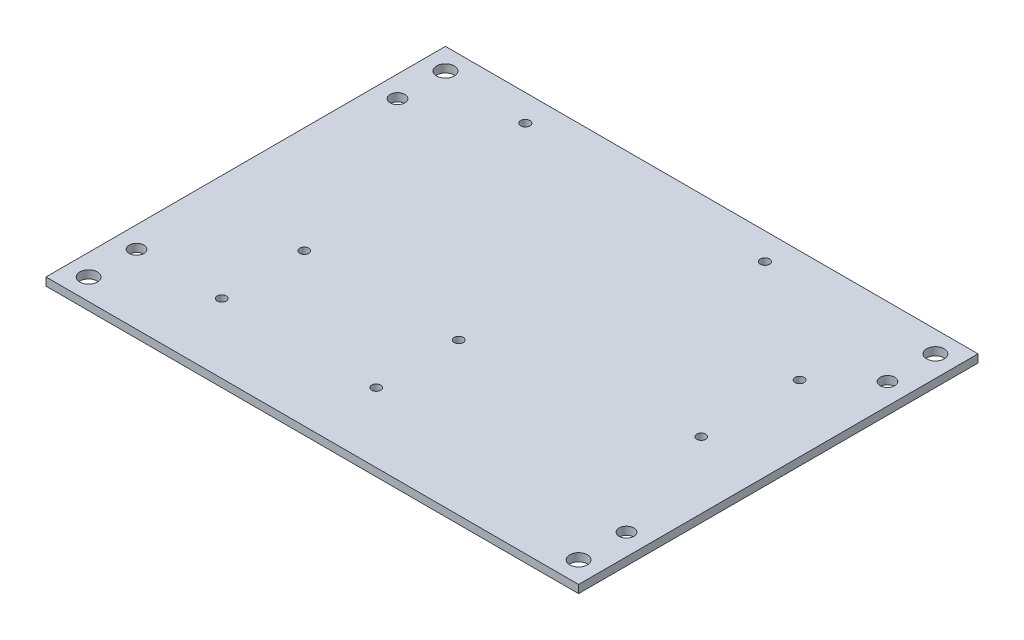
ISO-10303-21;
HEADER;
FILE_DESCRIPTION(('STEP AP214'),'2;1');
FILE_NAME('part.step','',(''),(''),'','','');
FILE_SCHEMA(('AUTOMOTIVE_DESIGN { 1 0 10303 214 1 1 1 1 }'));
ENDSEC;
DATA;
#1=APPLICATION_CONTEXT('core data for automotive mechanical design processes');
#2=APPLICATION_PROTOCOL_DEFINITION('international standard','automotive_design',2000,#1);
#3=PRODUCT_CONTEXT('',#1,'mechanical');
#4=PRODUCT('Part','Part','',(#3));
#5=PRODUCT_RELATED_PRODUCT_CATEGORY('part','',(#4));
#6=PRODUCT_DEFINITION_FORMATION('','',#4);
#7=PRODUCT_DEFINITION_CONTEXT('part definition',#1,'design');
#8=PRODUCT_DEFINITION('design','',#6,#7);
#9=PRODUCT_DEFINITION_SHAPE('','',#8);
#10=(LENGTH_UNIT() NAMED_UNIT(*) SI_UNIT(.MILLI.,.METRE.));
#11=(NAMED_UNIT(*) PLANE_ANGLE_UNIT() SI_UNIT($,.RADIAN.));
#12=(NAMED_UNIT(*) SI_UNIT($,.STERADIAN.) SOLID_ANGLE_UNIT());
#13=UNCERTAINTY_MEASURE_WITH_UNIT(LENGTH_MEASURE(1.E-05),#10,'distance_accuracy_value','');
#14=(GEOMETRIC_REPRESENTATION_CONTEXT(3) GLOBAL_UNCERTAINTY_ASSIGNED_CONTEXT((#13)) GLOBAL_UNIT_ASSIGNED_CONTEXT((#10,
#11,#12)) REPRESENTATION_CONTEXT('',''));
#15=CARTESIAN_POINT('',(0.,0.,0.));
#16=DIRECTION('',(0.,0.,1.));
#17=DIRECTION('',(1.,0.,0.));
#18=AXIS2_PLACEMENT_3D('',#15,#16,#17);
#19=CARTESIAN_POINT('',(0.,3.,0.));
#20=DIRECTION('',(1.,0.,0.));
#21=DIRECTION('',(0.,0.,-1.));
#22=AXIS2_PLACEMENT_3D('',#19,#20,#21);
#23=PLANE('',#22);
#24=DIRECTION('',(0.,0.,1.));
#25=VECTOR('',#24,1.);
#26=CARTESIAN_POINT('',(0.,0.,0.));
#27=LINE('',#26,#25);
#28=CARTESIAN_POINT('',(0.,0.,-150.));
#29=VERTEX_POINT('',#28);
#30=CARTESIAN_POINT('',(0.,0.,0.));
#31=VERTEX_POINT('',#30);
#32=EDGE_CURVE('E106',#29,#31,#27,.T.);
#33=ORIENTED_EDGE('',*,*,#32,.T.);
#34=DIRECTION('',(0.,-1.,0.));
#35=VECTOR('',#34,1.);
#36=CARTESIAN_POINT('',(0.,3.,0.));
#37=LINE('',#36,#35);
#38=CARTESIAN_POINT('',(0.,3.,0.));
#39=VERTEX_POINT('',#38);
#40=EDGE_CURVE('E11',#39,#31,#37,.T.);
#41=ORIENTED_EDGE('',*,*,#40,.F.);
#42=DIRECTION('',(0.,0.,1.));
#43=VECTOR('',#42,1.);
#44=CARTESIAN_POINT('',(0.,3.,0.));
#45=LINE('',#44,#43);
#46=CARTESIAN_POINT('',(0.,3.,-150.));
#47=VERTEX_POINT('',#46);
#48=EDGE_CURVE('E94',#47,#39,#45,.T.);
#49=ORIENTED_EDGE('',*,*,#48,.F.);
#50=DIRECTION('',(0.,-1.,0.));
#51=VECTOR('',#50,1.);
#52=CARTESIAN_POINT('',(0.,3.,-150.));
#53=LINE('',#52,#51);
#54=EDGE_CURVE('E102',#47,#29,#53,.T.);
#55=ORIENTED_EDGE('',*,*,#54,.T.);
#56=EDGE_LOOP('',(#33,#41,#49,#55));
#57=FACE_BOUND('',#56,.T.);
#58=ADVANCED_FACE('F43',(#57),#23,.F.);
#59=CARTESIAN_POINT('',(0.,3.,0.));
#60=DIRECTION('',(0.,0.,-1.));
#61=DIRECTION('',(-1.,0.,0.));
#62=AXIS2_PLACEMENT_3D('',#59,#60,#61);
#63=PLANE('',#62);
#64=DIRECTION('',(1.,0.,0.));
#65=VECTOR('',#64,1.);
#66=CARTESIAN_POINT('',(0.,0.,0.));
#67=LINE('',#66,#65);
#68=CARTESIAN_POINT('',(200.,0.,0.));
#69=VERTEX_POINT('',#68);
#70=EDGE_CURVE('E98',#31,#69,#67,.T.);
#71=ORIENTED_EDGE('',*,*,#70,.T.);
#72=DIRECTION('',(0.,-1.,0.));
#73=VECTOR('',#72,1.);
#74=CARTESIAN_POINT('',(200.,3.,0.));
#75=LINE('',#74,#73);
#76=CARTESIAN_POINT('',(200.,3.,0.));
#77=VERTEX_POINT('',#76);
#78=EDGE_CURVE('E51',#77,#69,#75,.T.);
#79=ORIENTED_EDGE('',*,*,#78,.F.);
#80=DIRECTION('',(1.,0.,0.));
#81=VECTOR('',#80,1.);
#82=CARTESIAN_POINT('',(0.,3.,0.));
#83=LINE('',#82,#81);
#84=EDGE_CURVE('E89',#39,#77,#83,.T.);
#85=ORIENTED_EDGE('',*,*,#84,.F.);
#86=ORIENTED_EDGE('',*,*,#40,.T.);
#87=EDGE_LOOP('',(#71,#79,#85,#86));
#88=FACE_BOUND('',#87,.T.);
#89=ADVANCED_FACE('F97',(#88),#63,.F.);
#90=CARTESIAN_POINT('',(200.,3.,0.));
#91=DIRECTION('',(-1.,0.,0.));
#92=DIRECTION('',(0.,0.,1.));
#93=AXIS2_PLACEMENT_3D('',#90,#91,#92);
#94=PLANE('',#93);
#95=DIRECTION('',(0.,0.,-1.));
#96=VECTOR('',#95,1.);
#97=CARTESIAN_POINT('',(200.,0.,0.));
#98=LINE('',#97,#96);
#99=CARTESIAN_POINT('',(200.,0.,-150.));
#100=VERTEX_POINT('',#99);
#101=EDGE_CURVE('E76',#69,#100,#98,.T.);
#102=ORIENTED_EDGE('',*,*,#101,.T.);
#103=DIRECTION('',(0.,-1.,0.));
#104=VECTOR('',#103,1.);
#105=CARTESIAN_POINT('',(200.,3.,-150.));
#106=LINE('',#105,#104);
#107=CARTESIAN_POINT('',(200.,3.,-150.));
#108=VERTEX_POINT('',#107);
#109=EDGE_CURVE('E99',#108,#100,#106,.T.);
#110=ORIENTED_EDGE('',*,*,#109,.F.);
#111=DIRECTION('',(0.,0.,-1.));
#112=VECTOR('',#111,1.);
#113=CARTESIAN_POINT('',(200.,3.,0.));
#114=LINE('',#113,#112);
#115=EDGE_CURVE('E92',#77,#108,#114,.T.);
#116=ORIENTED_EDGE('',*,*,#115,.F.);
#117=ORIENTED_EDGE('',*,*,#78,.T.);
#118=EDGE_LOOP('',(#102,#110,#116,#117));
#119=FACE_BOUND('',#118,.T.);
#120=ADVANCED_FACE('F100',(#119),#94,.F.);
#121=CARTESIAN_POINT('',(0.,3.,-150.));
#122=DIRECTION('',(0.,0.,1.));
#123=DIRECTION('',(1.,0.,0.));
#124=AXIS2_PLACEMENT_3D('',#121,#122,#123);
#125=PLANE('',#124);
#126=DIRECTION('',(-1.,0.,0.));
#127=VECTOR('',#126,1.);
#128=CARTESIAN_POINT('',(0.,0.,-150.));
#129=LINE('',#128,#127);
#130=EDGE_CURVE('E82',#100,#29,#129,.T.);
#131=ORIENTED_EDGE('',*,*,#130,.T.);
#132=ORIENTED_EDGE('',*,*,#54,.F.);
#133=DIRECTION('',(-1.,0.,0.));
#134=VECTOR('',#133,1.);
#135=CARTESIAN_POINT('',(0.,3.,-150.));
#136=LINE('',#135,#134);
#137=EDGE_CURVE('E59',#108,#47,#136,.T.);
#138=ORIENTED_EDGE('',*,*,#137,.F.);
#139=ORIENTED_EDGE('',*,*,#109,.T.);
#140=EDGE_LOOP('',(#131,#132,#138,#139));
#141=FACE_BOUND('',#140,.T.);
#142=ADVANCED_FACE('F114',(#141),#125,.F.);
#143=CARTESIAN_POINT('',(0.,3.,0.));
#144=DIRECTION('',(0.,-1.,0.));
#145=DIRECTION('',(0.,0.,-1.));
#146=AXIS2_PLACEMENT_3D('',#143,#144,#145);
#147=PLANE('',#146);
#148=CARTESIAN_POINT('',(98.,3.,-57.));
#149=DIRECTION('',(0.,1.,0.));
#150=DIRECTION('',(0.,0.,1.));
#151=AXIS2_PLACEMENT_3D('',#148,#149,#150);
#152=CIRCLE('',#151,1.70000000000001);
#153=CARTESIAN_POINT('',(98.,3.,-55.3));
#154=VERTEX_POINT('',#153);
#155=EDGE_CURVE('E133',#154,#154,#152,.T.);
#156=ORIENTED_EDGE('',*,*,#155,.F.);
#157=EDGE_LOOP('',(#156));
#158=FACE_BOUND('',#157,.T.);
#159=CARTESIAN_POINT('',(98.,3.,-26.));
#160=DIRECTION('',(0.,1.,0.));
#161=DIRECTION('',(0.,0.,1.));
#162=AXIS2_PLACEMENT_3D('',#159,#160,#161);
#163=CIRCLE('',#162,1.70000000000001);
#164=CARTESIAN_POINT('',(98.,3.,-24.3));
#165=VERTEX_POINT('',#164);
#166=EDGE_CURVE('E150',#165,#165,#163,.T.);
#167=ORIENTED_EDGE('',*,*,#166,.F.);
#168=EDGE_LOOP('',(#167));
#169=FACE_BOUND('',#168,.T.);
#170=CARTESIAN_POINT('',(40.,3.,-26.));
#171=DIRECTION('',(0.,1.,0.));
#172=DIRECTION('',(0.,0.,1.));
#173=AXIS2_PLACEMENT_3D('',#170,#171,#172);
#174=CIRCLE('',#173,1.7);
#175=CARTESIAN_POINT('',(40.,3.,-24.3));
#176=VERTEX_POINT('',#175);
#177=EDGE_CURVE('E157',#176,#176,#174,.T.);
#178=ORIENTED_EDGE('',*,*,#177,.F.);
#179=EDGE_LOOP('',(#178));
#180=FACE_BOUND('',#179,.T.);
#181=CARTESIAN_POINT('',(175.,3.,-108.));
#182=DIRECTION('',(0.,1.,0.));
#183=DIRECTION('',(0.,0.,1.));
#184=AXIS2_PLACEMENT_3D('',#181,#182,#183);
#185=CIRCLE('',#184,1.70000000000001);
#186=CARTESIAN_POINT('',(175.,3.,-106.3));
#187=VERTEX_POINT('',#186);
#188=EDGE_CURVE('E162',#187,#187,#185,.T.);
#189=ORIENTED_EDGE('',*,*,#188,.F.);
#190=EDGE_LOOP('',(#189));
#191=FACE_BOUND('',#190,.T.);
#192=CARTESIAN_POINT('',(40.,3.,-57.));
#193=DIRECTION('',(0.,1.,0.));
#194=DIRECTION('',(0.,0.,1.));
#195=AXIS2_PLACEMENT_3D('',#192,#193,#194);
#196=CIRCLE('',#195,1.7);
#197=CARTESIAN_POINT('',(40.,3.,-55.3));
#198=VERTEX_POINT('',#197);
#199=EDGE_CURVE('E126',#198,#198,#196,.T.);
#200=ORIENTED_EDGE('',*,*,#199,.F.);
#201=EDGE_LOOP('',(#200));
#202=FACE_BOUND('',#201,.T.);
#203=CARTESIAN_POINT('',(192.,3.,-142.));
#204=DIRECTION('',(0.,1.,0.));
#205=DIRECTION('',(0.,0.,-1.));
#206=AXIS2_PLACEMENT_3D('',#203,#204,#205);
#207=CIRCLE('',#206,3.3);
#208=CARTESIAN_POINT('',(192.,3.,-145.3));
#209=VERTEX_POINT('',#208);
#210=EDGE_CURVE('E134',#209,#209,#207,.T.);
#211=ORIENTED_EDGE('',*,*,#210,.F.);
#212=EDGE_LOOP('',(#211));
#213=FACE_BOUND('',#212,.T.);
#214=CARTESIAN_POINT('',(192.,3.,-8.00000000000004));
#215=DIRECTION('',(0.,1.,0.));
#216=DIRECTION('',(0.,0.,1.));
#217=AXIS2_PLACEMENT_3D('',#214,#215,#216);
#218=CIRCLE('',#217,3.3);
#219=CARTESIAN_POINT('',(192.,3.,-4.70000000000003));
#220=VERTEX_POINT('',#219);
#221=EDGE_CURVE('E140',#220,#220,#218,.T.);
#222=ORIENTED_EDGE('',*,*,#221,.F.);
#223=EDGE_LOOP('',(#222));
#224=FACE_BOUND('',#223,.T.);
#225=CARTESIAN_POINT('',(8.00000000000001,3.,-8.00000000000004));
#226=DIRECTION('',(0.,1.,0.));
#227=DIRECTION('',(0.,0.,-1.));
#228=AXIS2_PLACEMENT_3D('',#225,#226,#227);
#229=CIRCLE('',#228,3.3);
#230=CARTESIAN_POINT('',(8.00000000000001,3.,-11.3));
#231=VERTEX_POINT('',#230);
#232=EDGE_CURVE('E125',#231,#231,#229,.T.);
#233=ORIENTED_EDGE('',*,*,#232,.F.);
#234=EDGE_LOOP('',(#233));
#235=FACE_BOUND('',#234,.T.);
#236=CARTESIAN_POINT('',(192.,3.,-124.));
#237=DIRECTION('',(0.,1.,0.));
#238=DIRECTION('',(0.,0.,-1.));
#239=AXIS2_PLACEMENT_3D('',#236,#237,#238);
#240=CIRCLE('',#239,2.74999999999998);
#241=CARTESIAN_POINT('',(192.,3.,-126.75));
#242=VERTEX_POINT('',#241);
#243=EDGE_CURVE('E193',#242,#242,#240,.T.);
#244=ORIENTED_EDGE('',*,*,#243,.F.);
#245=EDGE_LOOP('',(#244));
#246=FACE_BOUND('',#245,.T.);
#247=CARTESIAN_POINT('',(40.,3.,-140.));
#248=DIRECTION('',(0.,1.,0.));
#249=DIRECTION('',(0.,0.,1.));
#250=AXIS2_PLACEMENT_3D('',#247,#248,#249);
#251=CIRCLE('',#250,1.75);
#252=CARTESIAN_POINT('',(40.,3.,-138.25));
#253=VERTEX_POINT('',#252);
#254=EDGE_CURVE('E198',#253,#253,#251,.T.);
#255=ORIENTED_EDGE('',*,*,#254,.F.);
#256=EDGE_LOOP('',(#255));
#257=FACE_BOUND('',#256,.T.);
#258=CARTESIAN_POINT('',(130.,3.,-140.));
#259=DIRECTION('',(0.,1.,0.));
#260=DIRECTION('',(0.,0.,1.));
#261=AXIS2_PLACEMENT_3D('',#258,#259,#260);
#262=CIRCLE('',#261,1.75000000000001);
#263=CARTESIAN_POINT('',(130.,3.,-138.25));
#264=VERTEX_POINT('',#263);
#265=EDGE_CURVE('E205',#264,#264,#262,.T.);
#266=ORIENTED_EDGE('',*,*,#265,.F.);
#267=EDGE_LOOP('',(#266));
#268=FACE_BOUND('',#267,.T.);
#269=CARTESIAN_POINT('',(175.,3.,-71.07));
#270=DIRECTION('',(0.,1.,0.));
#271=DIRECTION('',(0.,0.,1.));
#272=AXIS2_PLACEMENT_3D('',#269,#270,#271);
#273=CIRCLE('',#272,1.70000000000001);
#274=CARTESIAN_POINT('',(175.,3.,-69.37));
#275=VERTEX_POINT('',#274);
#276=EDGE_CURVE('E169',#275,#275,#273,.T.);
#277=ORIENTED_EDGE('',*,*,#276,.F.);
#278=EDGE_LOOP('',(#277));
#279=FACE_BOUND('',#278,.T.);
#280=CARTESIAN_POINT('',(8.00000000000001,3.,-26.));
#281=DIRECTION('',(0.,1.,0.));
#282=DIRECTION('',(0.,0.,-1.));
#283=AXIS2_PLACEMENT_3D('',#280,#281,#282);
#284=CIRCLE('',#283,2.75);
#285=CARTESIAN_POINT('',(8.00000000000001,3.,-28.75));
#286=VERTEX_POINT('',#285);
#287=EDGE_CURVE('E174',#286,#286,#284,.T.);
#288=ORIENTED_EDGE('',*,*,#287,.F.);
#289=EDGE_LOOP('',(#288));
#290=FACE_BOUND('',#289,.T.);
#291=CARTESIAN_POINT('',(8.00000000000001,3.,-124.));
#292=DIRECTION('',(0.,1.,0.));
#293=DIRECTION('',(0.,0.,1.));
#294=AXIS2_PLACEMENT_3D('',#291,#292,#293);
#295=CIRCLE('',#294,2.75);
#296=CARTESIAN_POINT('',(8.00000000000001,3.,-121.25));
#297=VERTEX_POINT('',#296);
#298=EDGE_CURVE('E181',#297,#297,#295,.T.);
#299=ORIENTED_EDGE('',*,*,#298,.F.);
#300=EDGE_LOOP('',(#299));
#301=FACE_BOUND('',#300,.T.);
#302=CARTESIAN_POINT('',(192.,3.,-26.0000000000001));
#303=DIRECTION('',(0.,1.,0.));
#304=DIRECTION('',(0.,0.,1.));
#305=AXIS2_PLACEMENT_3D('',#302,#303,#304);
#306=CIRCLE('',#305,2.74999999999998);
#307=CARTESIAN_POINT('',(192.,3.,-23.2500000000001));
#308=VERTEX_POINT('',#307);
#309=EDGE_CURVE('E186',#308,#308,#306,.T.);
#310=ORIENTED_EDGE('',*,*,#309,.F.);
#311=EDGE_LOOP('',(#310));
#312=FACE_BOUND('',#311,.T.);
#313=CARTESIAN_POINT('',(8.00000000000001,3.,-142.));
#314=DIRECTION('',(0.,1.,0.));
#315=DIRECTION('',(0.,0.,1.));
#316=AXIS2_PLACEMENT_3D('',#313,#314,#315);
#317=CIRCLE('',#316,3.3);
#318=CARTESIAN_POINT('',(8.00000000000001,3.,-138.7));
#319=VERTEX_POINT('',#318);
#320=EDGE_CURVE('E122',#319,#319,#317,.T.);
#321=ORIENTED_EDGE('',*,*,#320,.F.);
#322=EDGE_LOOP('',(#321));
#323=FACE_BOUND('',#322,.T.);
#324=ORIENTED_EDGE('',*,*,#48,.T.);
#325=ORIENTED_EDGE('',*,*,#84,.T.);
#326=ORIENTED_EDGE('',*,*,#115,.T.);
#327=ORIENTED_EDGE('',*,*,#137,.T.);
#328=EDGE_LOOP('',(#324,#325,#326,#327));
#329=FACE_BOUND('',#328,.T.);
#330=ADVANCED_FACE('F90',(#158,#169,#180,#191,#202,#213,#224,#235,#246,#257,#268,#279,#290,#301,
#312,#323,#329),#147,.F.);
#331=CARTESIAN_POINT('',(0.,0.,0.));
#332=DIRECTION('',(0.,-1.,0.));
#333=DIRECTION('',(0.,0.,-1.));
#334=AXIS2_PLACEMENT_3D('',#331,#332,#333);
#335=PLANE('',#334);
#336=CARTESIAN_POINT('',(98.,0.,-57.));
#337=DIRECTION('',(0.,-1.,0.));
#338=DIRECTION('',(0.,0.,-1.));
#339=AXIS2_PLACEMENT_3D('',#336,#337,#338);
#340=CIRCLE('',#339,1.70000000000001);
#341=CARTESIAN_POINT('',(98.,0.,-58.7));
#342=VERTEX_POINT('',#341);
#343=EDGE_CURVE('E153',#342,#342,#340,.F.);
#344=ORIENTED_EDGE('',*,*,#343,.T.);
#345=EDGE_LOOP('',(#344));
#346=FACE_BOUND('',#345,.T.);
#347=CARTESIAN_POINT('',(98.,0.,-26.));
#348=DIRECTION('',(0.,-1.,0.));
#349=DIRECTION('',(0.,0.,-1.));
#350=AXIS2_PLACEMENT_3D('',#347,#348,#349);
#351=CIRCLE('',#350,1.70000000000001);
#352=CARTESIAN_POINT('',(98.,0.,-27.7));
#353=VERTEX_POINT('',#352);
#354=EDGE_CURVE('E154',#353,#353,#351,.F.);
#355=ORIENTED_EDGE('',*,*,#354,.T.);
#356=EDGE_LOOP('',(#355));
#357=FACE_BOUND('',#356,.T.);
#358=CARTESIAN_POINT('',(40.,0.,-26.));
#359=DIRECTION('',(0.,-1.,0.));
#360=DIRECTION('',(0.,0.,-1.));
#361=AXIS2_PLACEMENT_3D('',#358,#359,#360);
#362=CIRCLE('',#361,1.7);
#363=CARTESIAN_POINT('',(40.,0.,-27.7));
#364=VERTEX_POINT('',#363);
#365=EDGE_CURVE('E165',#364,#364,#362,.F.);
#366=ORIENTED_EDGE('',*,*,#365,.T.);
#367=EDGE_LOOP('',(#366));
#368=FACE_BOUND('',#367,.T.);
#369=CARTESIAN_POINT('',(175.,0.,-108.));
#370=DIRECTION('',(0.,-1.,0.));
#371=DIRECTION('',(0.,0.,-1.));
#372=AXIS2_PLACEMENT_3D('',#369,#370,#371);
#373=CIRCLE('',#372,1.70000000000001);
#374=CARTESIAN_POINT('',(175.,0.,-109.7));
#375=VERTEX_POINT('',#374);
#376=EDGE_CURVE('E166',#375,#375,#373,.F.);
#377=ORIENTED_EDGE('',*,*,#376,.T.);
#378=EDGE_LOOP('',(#377));
#379=FACE_BOUND('',#378,.T.);
#380=CARTESIAN_POINT('',(40.,0.,-57.));
#381=DIRECTION('',(0.,-1.,0.));
#382=DIRECTION('',(0.,0.,-1.));
#383=AXIS2_PLACEMENT_3D('',#380,#381,#382);
#384=CIRCLE('',#383,1.7);
#385=CARTESIAN_POINT('',(40.,0.,-58.7));
#386=VERTEX_POINT('',#385);
#387=EDGE_CURVE('E130',#386,#386,#384,.F.);
#388=ORIENTED_EDGE('',*,*,#387,.T.);
#389=EDGE_LOOP('',(#388));
#390=FACE_BOUND('',#389,.T.);
#391=CARTESIAN_POINT('',(192.,0.,-142.));
#392=DIRECTION('',(0.,-1.,0.));
#393=DIRECTION('',(0.,0.,-1.));
#394=AXIS2_PLACEMENT_3D('',#391,#392,#393);
#395=CIRCLE('',#394,3.3);
#396=CARTESIAN_POINT('',(192.,0.,-145.3));
#397=VERTEX_POINT('',#396);
#398=EDGE_CURVE('E129',#397,#397,#395,.F.);
#399=ORIENTED_EDGE('',*,*,#398,.T.);
#400=EDGE_LOOP('',(#399));
#401=FACE_BOUND('',#400,.T.);
#402=CARTESIAN_POINT('',(192.,0.,-8.00000000000004));
#403=DIRECTION('',(0.,-1.,0.));
#404=DIRECTION('',(0.,0.,-1.));
#405=AXIS2_PLACEMENT_3D('',#402,#403,#404);
#406=CIRCLE('',#405,3.3);
#407=CARTESIAN_POINT('',(192.,0.,-11.3));
#408=VERTEX_POINT('',#407);
#409=EDGE_CURVE('E137',#408,#408,#406,.F.);
#410=ORIENTED_EDGE('',*,*,#409,.T.);
#411=EDGE_LOOP('',(#410));
#412=FACE_BOUND('',#411,.T.);
#413=CARTESIAN_POINT('',(8.00000000000001,0.,-8.00000000000004));
#414=DIRECTION('',(0.,-1.,0.));
#415=DIRECTION('',(0.,0.,-1.));
#416=AXIS2_PLACEMENT_3D('',#413,#414,#415);
#417=CIRCLE('',#416,3.3);
#418=CARTESIAN_POINT('',(8.00000000000001,0.,-11.3));
#419=VERTEX_POINT('',#418);
#420=EDGE_CURVE('E143',#419,#419,#417,.F.);
#421=ORIENTED_EDGE('',*,*,#420,.T.);
#422=EDGE_LOOP('',(#421));
#423=FACE_BOUND('',#422,.T.);
#424=CARTESIAN_POINT('',(192.,0.,-124.));
#425=DIRECTION('',(0.,-1.,0.));
#426=DIRECTION('',(0.,0.,-1.));
#427=AXIS2_PLACEMENT_3D('',#424,#425,#426);
#428=CIRCLE('',#427,2.74999999999998);
#429=CARTESIAN_POINT('',(192.,0.,-126.75));
#430=VERTEX_POINT('',#429);
#431=EDGE_CURVE('E201',#430,#430,#428,.F.);
#432=ORIENTED_EDGE('',*,*,#431,.T.);
#433=EDGE_LOOP('',(#432));
#434=FACE_BOUND('',#433,.T.);
#435=CARTESIAN_POINT('',(40.,0.,-140.));
#436=DIRECTION('',(0.,-1.,0.));
#437=DIRECTION('',(0.,0.,-1.));
#438=AXIS2_PLACEMENT_3D('',#435,#436,#437);
#439=CIRCLE('',#438,1.75);
#440=CARTESIAN_POINT('',(40.,0.,-141.75));
#441=VERTEX_POINT('',#440);
#442=EDGE_CURVE('E202',#441,#441,#439,.F.);
#443=ORIENTED_EDGE('',*,*,#442,.T.);
#444=EDGE_LOOP('',(#443));
#445=FACE_BOUND('',#444,.T.);
#446=CARTESIAN_POINT('',(130.,0.,-140.));
#447=DIRECTION('',(0.,-1.,0.));
#448=DIRECTION('',(0.,0.,-1.));
#449=AXIS2_PLACEMENT_3D('',#446,#447,#448);
#450=CIRCLE('',#449,1.75000000000001);
#451=CARTESIAN_POINT('',(130.,0.,-141.75));
#452=VERTEX_POINT('',#451);
#453=EDGE_CURVE('E212',#452,#452,#450,.F.);
#454=ORIENTED_EDGE('',*,*,#453,.T.);
#455=EDGE_LOOP('',(#454));
#456=FACE_BOUND('',#455,.T.);
#457=CARTESIAN_POINT('',(175.,0.,-71.07));
#458=DIRECTION('',(0.,-1.,0.));
#459=DIRECTION('',(0.,0.,-1.));
#460=AXIS2_PLACEMENT_3D('',#457,#458,#459);
#461=CIRCLE('',#460,1.70000000000001);
#462=CARTESIAN_POINT('',(175.,0.,-72.77));
#463=VERTEX_POINT('',#462);
#464=EDGE_CURVE('E177',#463,#463,#461,.F.);
#465=ORIENTED_EDGE('',*,*,#464,.T.);
#466=EDGE_LOOP('',(#465));
#467=FACE_BOUND('',#466,.T.);
#468=CARTESIAN_POINT('',(8.00000000000001,0.,-26.));
#469=DIRECTION('',(0.,-1.,0.));
#470=DIRECTION('',(0.,0.,-1.));
#471=AXIS2_PLACEMENT_3D('',#468,#469,#470);
#472=CIRCLE('',#471,2.75);
#473=CARTESIAN_POINT('',(8.00000000000001,0.,-28.75));
#474=VERTEX_POINT('',#473);
#475=EDGE_CURVE('E178',#474,#474,#472,.F.);
#476=ORIENTED_EDGE('',*,*,#475,.T.);
#477=EDGE_LOOP('',(#476));
#478=FACE_BOUND('',#477,.T.);
#479=CARTESIAN_POINT('',(8.00000000000001,0.,-124.));
#480=DIRECTION('',(0.,-1.,0.));
#481=DIRECTION('',(0.,0.,-1.));
#482=AXIS2_PLACEMENT_3D('',#479,#480,#481);
#483=CIRCLE('',#482,2.75);
#484=CARTESIAN_POINT('',(8.00000000000001,0.,-126.75));
#485=VERTEX_POINT('',#484);
#486=EDGE_CURVE('E189',#485,#485,#483,.F.);
#487=ORIENTED_EDGE('',*,*,#486,.T.);
#488=EDGE_LOOP('',(#487));
#489=FACE_BOUND('',#488,.T.);
#490=CARTESIAN_POINT('',(192.,0.,-26.0000000000001));
#491=DIRECTION('',(0.,-1.,0.));
#492=DIRECTION('',(0.,0.,-1.));
#493=AXIS2_PLACEMENT_3D('',#490,#491,#492);
#494=CIRCLE('',#493,2.74999999999998);
#495=CARTESIAN_POINT('',(192.,0.,-28.75));
#496=VERTEX_POINT('',#495);
#497=EDGE_CURVE('E190',#496,#496,#494,.F.);
#498=ORIENTED_EDGE('',*,*,#497,.T.);
#499=EDGE_LOOP('',(#498));
#500=FACE_BOUND('',#499,.T.);
#501=CARTESIAN_POINT('',(8.00000000000001,0.,-142.));
#502=DIRECTION('',(0.,-1.,0.));
#503=DIRECTION('',(0.,0.,-1.));
#504=AXIS2_PLACEMENT_3D('',#501,#502,#503);
#505=CIRCLE('',#504,3.3);
#506=CARTESIAN_POINT('',(8.00000000000001,0.,-145.3));
#507=VERTEX_POINT('',#506);
#508=EDGE_CURVE('E109',#507,#507,#505,.F.);
#509=ORIENTED_EDGE('',*,*,#508,.T.);
#510=EDGE_LOOP('',(#509));
#511=FACE_BOUND('',#510,.T.);
#512=ORIENTED_EDGE('',*,*,#32,.F.);
#513=ORIENTED_EDGE('',*,*,#130,.F.);
#514=ORIENTED_EDGE('',*,*,#101,.F.);
#515=ORIENTED_EDGE('',*,*,#70,.F.);
#516=EDGE_LOOP('',(#512,#513,#514,#515));
#517=FACE_BOUND('',#516,.T.);
#518=ADVANCED_FACE('F117',(#346,#357,#368,#379,#390,#401,#412,#423,#434,#445,#456,#467,#478,
#489,#500,#511,#517),#335,.T.);
#519=CARTESIAN_POINT('',(8.00000000000001,-9.33380951166243,-142.));
#520=DIRECTION('',(0.,1.,0.));
#521=DIRECTION('',(0.,0.,1.));
#522=AXIS2_PLACEMENT_3D('',#519,#520,#521);
#523=CYLINDRICAL_SURFACE('',#522,3.3);
#524=ORIENTED_EDGE('',*,*,#320,.T.);
#525=EDGE_LOOP('',(#524));
#526=FACE_BOUND('',#525,.T.);
#527=ORIENTED_EDGE('',*,*,#508,.F.);
#528=EDGE_LOOP('',(#527));
#529=FACE_BOUND('',#528,.T.);
#530=ADVANCED_FACE('F248',(#526,#529),#523,.F.);
#531=CARTESIAN_POINT('',(192.,-9.33380951166243,-26.0000000000001));
#532=DIRECTION('',(0.,1.,0.));
#533=DIRECTION('',(0.,0.,1.));
#534=AXIS2_PLACEMENT_3D('',#531,#532,#533);
#535=CYLINDRICAL_SURFACE('',#534,2.74999999999998);
#536=ORIENTED_EDGE('',*,*,#309,.T.);
#537=EDGE_LOOP('',(#536));
#538=FACE_BOUND('',#537,.T.);
#539=ORIENTED_EDGE('',*,*,#497,.F.);
#540=EDGE_LOOP('',(#539));
#541=FACE_BOUND('',#540,.T.);
#542=ADVANCED_FACE('F255',(#538,#541),#535,.F.);
#543=CARTESIAN_POINT('',(8.00000000000001,-9.33380951166243,-124.));
#544=DIRECTION('',(0.,1.,0.));
#545=DIRECTION('',(0.,0.,1.));
#546=AXIS2_PLACEMENT_3D('',#543,#544,#545);
#547=CYLINDRICAL_SURFACE('',#546,2.75);
#548=ORIENTED_EDGE('',*,*,#298,.T.);
#549=EDGE_LOOP('',(#548));
#550=FACE_BOUND('',#549,.T.);
#551=ORIENTED_EDGE('',*,*,#486,.F.);
#552=EDGE_LOOP('',(#551));
#553=FACE_BOUND('',#552,.T.);
#554=ADVANCED_FACE('F290',(#550,#553),#547,.F.);
#555=CARTESIAN_POINT('',(8.00000000000001,-9.33380951166243,-26.));
#556=DIRECTION('',(0.,1.,0.));
#557=DIRECTION('',(0.,0.,1.));
#558=AXIS2_PLACEMENT_3D('',#555,#556,#557);
#559=CYLINDRICAL_SURFACE('',#558,2.75);
#560=ORIENTED_EDGE('',*,*,#287,.T.);
#561=EDGE_LOOP('',(#560));
#562=FACE_BOUND('',#561,.T.);
#563=ORIENTED_EDGE('',*,*,#475,.F.);
#564=EDGE_LOOP('',(#563));
#565=FACE_BOUND('',#564,.T.);
#566=ADVANCED_FACE('F231',(#562,#565),#559,.F.);
#567=CARTESIAN_POINT('',(175.,-9.33380951166243,-71.07));
#568=DIRECTION('',(0.,1.,0.));
#569=DIRECTION('',(0.,0.,1.));
#570=AXIS2_PLACEMENT_3D('',#567,#568,#569);
#571=CYLINDRICAL_SURFACE('',#570,1.70000000000001);
#572=ORIENTED_EDGE('',*,*,#276,.T.);
#573=EDGE_LOOP('',(#572));
#574=FACE_BOUND('',#573,.T.);
#575=ORIENTED_EDGE('',*,*,#464,.F.);
#576=EDGE_LOOP('',(#575));
#577=FACE_BOUND('',#576,.T.);
#578=ADVANCED_FACE('F221',(#574,#577),#571,.F.);
#579=CARTESIAN_POINT('',(130.,-9.33380951166243,-140.));
#580=DIRECTION('',(0.,1.,0.));
#581=DIRECTION('',(0.,0.,1.));
#582=AXIS2_PLACEMENT_3D('',#579,#580,#581);
#583=CYLINDRICAL_SURFACE('',#582,1.75000000000001);
#584=ORIENTED_EDGE('',*,*,#265,.T.);
#585=EDGE_LOOP('',(#584));
#586=FACE_BOUND('',#585,.T.);
#587=ORIENTED_EDGE('',*,*,#453,.F.);
#588=EDGE_LOOP('',(#587));
#589=FACE_BOUND('',#588,.T.);
#590=ADVANCED_FACE('F218',(#586,#589),#583,.F.);
#591=CARTESIAN_POINT('',(40.,-9.33380951166243,-140.));
#592=DIRECTION('',(0.,1.,0.));
#593=DIRECTION('',(0.,0.,1.));
#594=AXIS2_PLACEMENT_3D('',#591,#592,#593);
#595=CYLINDRICAL_SURFACE('',#594,1.75);
#596=ORIENTED_EDGE('',*,*,#254,.T.);
#597=EDGE_LOOP('',(#596));
#598=FACE_BOUND('',#597,.T.);
#599=ORIENTED_EDGE('',*,*,#442,.F.);
#600=EDGE_LOOP('',(#599));
#601=FACE_BOUND('',#600,.T.);
#602=ADVANCED_FACE('F220',(#598,#601),#595,.F.);
#603=CARTESIAN_POINT('',(192.,-9.33380951166243,-124.));
#604=DIRECTION('',(0.,1.,0.));
#605=DIRECTION('',(0.,0.,1.));
#606=AXIS2_PLACEMENT_3D('',#603,#604,#605);
#607=CYLINDRICAL_SURFACE('',#606,2.74999999999998);
#608=ORIENTED_EDGE('',*,*,#243,.T.);
#609=EDGE_LOOP('',(#608));
#610=FACE_BOUND('',#609,.T.);
#611=ORIENTED_EDGE('',*,*,#431,.F.);
#612=EDGE_LOOP('',(#611));
#613=FACE_BOUND('',#612,.T.);
#614=ADVANCED_FACE('F228',(#610,#613),#607,.F.);
#615=CARTESIAN_POINT('',(8.00000000000001,-9.33380951166243,-8.00000000000004));
#616=DIRECTION('',(0.,1.,0.));
#617=DIRECTION('',(0.,0.,1.));
#618=AXIS2_PLACEMENT_3D('',#615,#616,#617);
#619=CYLINDRICAL_SURFACE('',#618,3.3);
#620=ORIENTED_EDGE('',*,*,#232,.T.);
#621=EDGE_LOOP('',(#620));
#622=FACE_BOUND('',#621,.T.);
#623=ORIENTED_EDGE('',*,*,#420,.F.);
#624=EDGE_LOOP('',(#623));
#625=FACE_BOUND('',#624,.T.);
#626=ADVANCED_FACE('F269',(#622,#625),#619,.F.);
#627=CARTESIAN_POINT('',(192.,-9.33380951166243,-8.00000000000004));
#628=DIRECTION('',(0.,1.,0.));
#629=DIRECTION('',(0.,0.,1.));
#630=AXIS2_PLACEMENT_3D('',#627,#628,#629);
#631=CYLINDRICAL_SURFACE('',#630,3.3);
#632=ORIENTED_EDGE('',*,*,#221,.T.);
#633=EDGE_LOOP('',(#632));
#634=FACE_BOUND('',#633,.T.);
#635=ORIENTED_EDGE('',*,*,#409,.F.);
#636=EDGE_LOOP('',(#635));
#637=FACE_BOUND('',#636,.T.);
#638=ADVANCED_FACE('F265',(#634,#637),#631,.F.);
#639=CARTESIAN_POINT('',(192.,-9.33380951166243,-142.));
#640=DIRECTION('',(0.,1.,0.));
#641=DIRECTION('',(0.,0.,1.));
#642=AXIS2_PLACEMENT_3D('',#639,#640,#641);
#643=CYLINDRICAL_SURFACE('',#642,3.3);
#644=ORIENTED_EDGE('',*,*,#210,.T.);
#645=EDGE_LOOP('',(#644));
#646=FACE_BOUND('',#645,.T.);
#647=ORIENTED_EDGE('',*,*,#398,.F.);
#648=EDGE_LOOP('',(#647));
#649=FACE_BOUND('',#648,.T.);
#650=ADVANCED_FACE('F261',(#646,#649),#643,.F.);
#651=CARTESIAN_POINT('',(40.,-9.33380951166243,-57.));
#652=DIRECTION('',(0.,1.,0.));
#653=DIRECTION('',(0.,0.,1.));
#654=AXIS2_PLACEMENT_3D('',#651,#652,#653);
#655=CYLINDRICAL_SURFACE('',#654,1.7);
#656=ORIENTED_EDGE('',*,*,#199,.T.);
#657=EDGE_LOOP('',(#656));
#658=FACE_BOUND('',#657,.T.);
#659=ORIENTED_EDGE('',*,*,#387,.F.);
#660=EDGE_LOOP('',(#659));
#661=FACE_BOUND('',#660,.T.);
#662=ADVANCED_FACE('F257',(#658,#661),#655,.F.);
#663=CARTESIAN_POINT('',(175.,-9.33380951166243,-108.));
#664=DIRECTION('',(0.,1.,0.));
#665=DIRECTION('',(0.,0.,1.));
#666=AXIS2_PLACEMENT_3D('',#663,#664,#665);
#667=CYLINDRICAL_SURFACE('',#666,1.70000000000001);
#668=ORIENTED_EDGE('',*,*,#188,.T.);
#669=EDGE_LOOP('',(#668));
#670=FACE_BOUND('',#669,.T.);
#671=ORIENTED_EDGE('',*,*,#376,.F.);
#672=EDGE_LOOP('',(#671));
#673=FACE_BOUND('',#672,.T.);
#674=ADVANCED_FACE('F260',(#670,#673),#667,.F.);
#675=CARTESIAN_POINT('',(40.,-9.33380951166243,-26.));
#676=DIRECTION('',(0.,1.,0.));
#677=DIRECTION('',(0.,0.,1.));
#678=AXIS2_PLACEMENT_3D('',#675,#676,#677);
#679=CYLINDRICAL_SURFACE('',#678,1.7);
#680=ORIENTED_EDGE('',*,*,#177,.T.);
#681=EDGE_LOOP('',(#680));
#682=FACE_BOUND('',#681,.T.);
#683=ORIENTED_EDGE('',*,*,#365,.F.);
#684=EDGE_LOOP('',(#683));
#685=FACE_BOUND('',#684,.T.);
#686=ADVANCED_FACE('F278',(#682,#685),#679,.F.);
#687=CARTESIAN_POINT('',(98.,-9.33380951166243,-26.));
#688=DIRECTION('',(0.,1.,0.));
#689=DIRECTION('',(0.,0.,1.));
#690=AXIS2_PLACEMENT_3D('',#687,#688,#689);
#691=CYLINDRICAL_SURFACE('',#690,1.70000000000001);
#692=ORIENTED_EDGE('',*,*,#166,.T.);
#693=EDGE_LOOP('',(#692));
#694=FACE_BOUND('',#693,.T.);
#695=ORIENTED_EDGE('',*,*,#354,.F.);
#696=EDGE_LOOP('',(#695));
#697=FACE_BOUND('',#696,.T.);
#698=ADVANCED_FACE('F274',(#694,#697),#691,.F.);
#699=CARTESIAN_POINT('',(98.,-9.33380951166243,-57.));
#700=DIRECTION('',(0.,1.,0.));
#701=DIRECTION('',(0.,0.,1.));
#702=AXIS2_PLACEMENT_3D('',#699,#700,#701);
#703=CYLINDRICAL_SURFACE('',#702,1.70000000000001);
#704=ORIENTED_EDGE('',*,*,#155,.T.);
#705=EDGE_LOOP('',(#704));
#706=FACE_BOUND('',#705,.T.);
#707=ORIENTED_EDGE('',*,*,#343,.F.);
#708=EDGE_LOOP('',(#707));
#709=FACE_BOUND('',#708,.T.);
#710=ADVANCED_FACE('F277',(#706,#709),#703,.F.);
#711=CLOSED_SHELL('',(#58,#89,#120,#142,#330,#518,#530,#542,#554,#566,#578,#590,#602,#614,#626,
#638,#650,#662,#674,#686,#698,#710));
#712=MANIFOLD_SOLID_BREP('B2',#711);
#713=ADVANCED_BREP_SHAPE_REPRESENTATION('',(#18,#712),#14);
#714=SHAPE_DEFINITION_REPRESENTATION(#9,#713);
ENDSEC;
END-ISO-10303-21;
